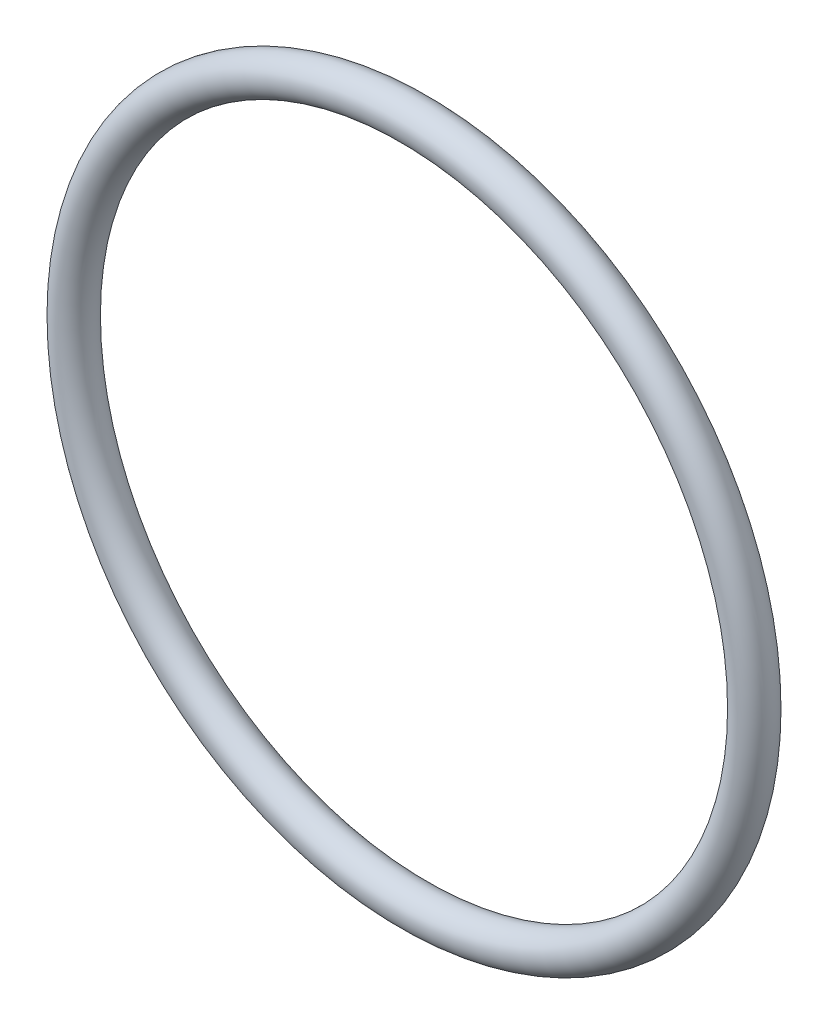
ISO-10303-21;
HEADER;
FILE_DESCRIPTION(('STEP AP214'),'2;1');
FILE_NAME('part.step','',(''),(''),'','','');
FILE_SCHEMA(('AUTOMOTIVE_DESIGN { 1 0 10303 214 1 1 1 1 }'));
ENDSEC;
DATA;
#1=APPLICATION_CONTEXT('core data for automotive mechanical design processes');
#2=APPLICATION_PROTOCOL_DEFINITION('international standard','automotive_design',2000,#1);
#3=PRODUCT_CONTEXT('',#1,'mechanical');
#4=PRODUCT('Part','Part','',(#3));
#5=PRODUCT_RELATED_PRODUCT_CATEGORY('part','',(#4));
#6=PRODUCT_DEFINITION_FORMATION('','',#4);
#7=PRODUCT_DEFINITION_CONTEXT('part definition',#1,'design');
#8=PRODUCT_DEFINITION('design','',#6,#7);
#9=PRODUCT_DEFINITION_SHAPE('','',#8);
#10=(LENGTH_UNIT() NAMED_UNIT(*) SI_UNIT(.MILLI.,.METRE.));
#11=(NAMED_UNIT(*) PLANE_ANGLE_UNIT() SI_UNIT($,.RADIAN.));
#12=(NAMED_UNIT(*) SI_UNIT($,.STERADIAN.) SOLID_ANGLE_UNIT());
#13=UNCERTAINTY_MEASURE_WITH_UNIT(LENGTH_MEASURE(1.E-05),#10,'distance_accuracy_value','');
#14=(GEOMETRIC_REPRESENTATION_CONTEXT(3) GLOBAL_UNCERTAINTY_ASSIGNED_CONTEXT((#13)) GLOBAL_UNIT_ASSIGNED_CONTEXT((#10,
#11,#12)) REPRESENTATION_CONTEXT('',''));
#15=CARTESIAN_POINT('',(0.,0.,0.));
#16=DIRECTION('',(0.,0.,1.));
#17=DIRECTION('',(1.,0.,0.));
#18=AXIS2_PLACEMENT_3D('',#15,#16,#17);
#19=CARTESIAN_POINT('',(0.,0.,0.));
#20=DIRECTION('',(0.,0.,1.));
#21=DIRECTION('',(1.,0.,0.));
#22=AXIS2_PLACEMENT_3D('',#19,#20,#21);
#23=TOROIDAL_SURFACE('',#22,27.,1.5);
#24=CARTESIAN_POINT('',(28.5,0.,0.));
#25=VERTEX_POINT('',#24);
#26=VERTEX_LOOP('',#25);
#27=FACE_BOUND('',#26,.T.);
#28=ADVANCED_FACE('F28',(#27),#23,.T.);
#29=CLOSED_SHELL('',(#28));
#30=MANIFOLD_SOLID_BREP('B2',#29);
#31=ADVANCED_BREP_SHAPE_REPRESENTATION('',(#18,#30),#14);
#32=SHAPE_DEFINITION_REPRESENTATION(#9,#31);
ENDSEC;
END-ISO-10303-21;
